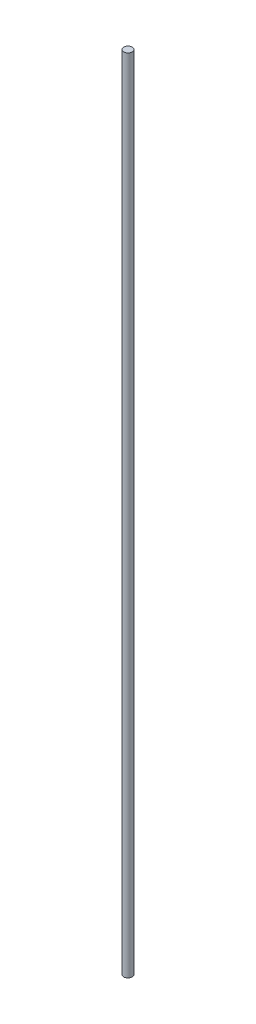
ISO-10303-21;
HEADER;
FILE_DESCRIPTION(('STEP AP214'),'2;1');
FILE_NAME('part.step','',(''),(''),'','','');
FILE_SCHEMA(('AUTOMOTIVE_DESIGN { 1 0 10303 214 1 1 1 1 }'));
ENDSEC;
DATA;
#1=APPLICATION_CONTEXT('core data for automotive mechanical design processes');
#2=APPLICATION_PROTOCOL_DEFINITION('international standard','automotive_design',2000,#1);
#3=PRODUCT_CONTEXT('',#1,'mechanical');
#4=PRODUCT('Part','Part','',(#3));
#5=PRODUCT_RELATED_PRODUCT_CATEGORY('part','',(#4));
#6=PRODUCT_DEFINITION_FORMATION('','',#4);
#7=PRODUCT_DEFINITION_CONTEXT('part definition',#1,'design');
#8=PRODUCT_DEFINITION('design','',#6,#7);
#9=PRODUCT_DEFINITION_SHAPE('','',#8);
#10=(LENGTH_UNIT() NAMED_UNIT(*) SI_UNIT(.MILLI.,.METRE.));
#11=(NAMED_UNIT(*) PLANE_ANGLE_UNIT() SI_UNIT($,.RADIAN.));
#12=(NAMED_UNIT(*) SI_UNIT($,.STERADIAN.) SOLID_ANGLE_UNIT());
#13=UNCERTAINTY_MEASURE_WITH_UNIT(LENGTH_MEASURE(1.E-05),#10,'distance_accuracy_value','');
#14=(GEOMETRIC_REPRESENTATION_CONTEXT(3) GLOBAL_UNCERTAINTY_ASSIGNED_CONTEXT((#13)) GLOBAL_UNIT_ASSIGNED_CONTEXT((#10,
#11,#12)) REPRESENTATION_CONTEXT('',''));
#15=CARTESIAN_POINT('',(0.,0.,0.));
#16=DIRECTION('',(0.,0.,1.));
#17=DIRECTION('',(1.,0.,0.));
#18=AXIS2_PLACEMENT_3D('',#15,#16,#17);
#19=CARTESIAN_POINT('',(0.,1500.,0.));
#20=DIRECTION('',(0.,-1.,0.));
#21=DIRECTION('',(0.,0.,-1.));
#22=AXIS2_PLACEMENT_3D('',#19,#20,#21);
#23=CYLINDRICAL_SURFACE('',#22,8.);
#24=CARTESIAN_POINT('',(0.,1500.,0.));
#25=DIRECTION('',(0.,1.,0.));
#26=DIRECTION('',(0.,0.,1.));
#27=AXIS2_PLACEMENT_3D('',#24,#25,#26);
#28=CIRCLE('',#27,8.);
#29=CARTESIAN_POINT('',(0.,1500.,8.));
#30=VERTEX_POINT('',#29);
#31=EDGE_CURVE('E10',#30,#30,#28,.T.);
#32=ORIENTED_EDGE('',*,*,#31,.F.);
#33=EDGE_LOOP('',(#32));
#34=FACE_BOUND('',#33,.T.);
#35=CARTESIAN_POINT('',(0.,0.,0.));
#36=DIRECTION('',(0.,1.,0.));
#37=DIRECTION('',(0.,0.,1.));
#38=AXIS2_PLACEMENT_3D('',#35,#36,#37);
#39=CIRCLE('',#38,8.);
#40=CARTESIAN_POINT('',(0.,0.,8.));
#41=VERTEX_POINT('',#40);
#42=EDGE_CURVE('E34',#41,#41,#39,.T.);
#43=ORIENTED_EDGE('',*,*,#42,.T.);
#44=EDGE_LOOP('',(#43));
#45=FACE_BOUND('',#44,.T.);
#46=ADVANCED_FACE('F31',(#34,#45),#23,.T.);
#47=CARTESIAN_POINT('',(0.,1500.,0.));
#48=DIRECTION('',(0.,1.,0.));
#49=DIRECTION('',(0.,0.,1.));
#50=AXIS2_PLACEMENT_3D('',#47,#48,#49);
#51=PLANE('',#50);
#52=ORIENTED_EDGE('',*,*,#31,.T.);
#53=EDGE_LOOP('',(#52));
#54=FACE_BOUND('',#53,.T.);
#55=ADVANCED_FACE('F46',(#54),#51,.T.);
#56=CARTESIAN_POINT('',(0.,0.,0.));
#57=DIRECTION('',(0.,1.,0.));
#58=DIRECTION('',(0.,0.,1.));
#59=AXIS2_PLACEMENT_3D('',#56,#57,#58);
#60=PLANE('',#59);
#61=ORIENTED_EDGE('',*,*,#42,.F.);
#62=EDGE_LOOP('',(#61));
#63=FACE_BOUND('',#62,.T.);
#64=ADVANCED_FACE('F44',(#63),#60,.F.);
#65=CLOSED_SHELL('',(#46,#55,#64));
#66=MANIFOLD_SOLID_BREP('B2',#65);
#67=ADVANCED_BREP_SHAPE_REPRESENTATION('',(#18,#66),#14);
#68=SHAPE_DEFINITION_REPRESENTATION(#9,#67);
ENDSEC;
END-ISO-10303-21;
